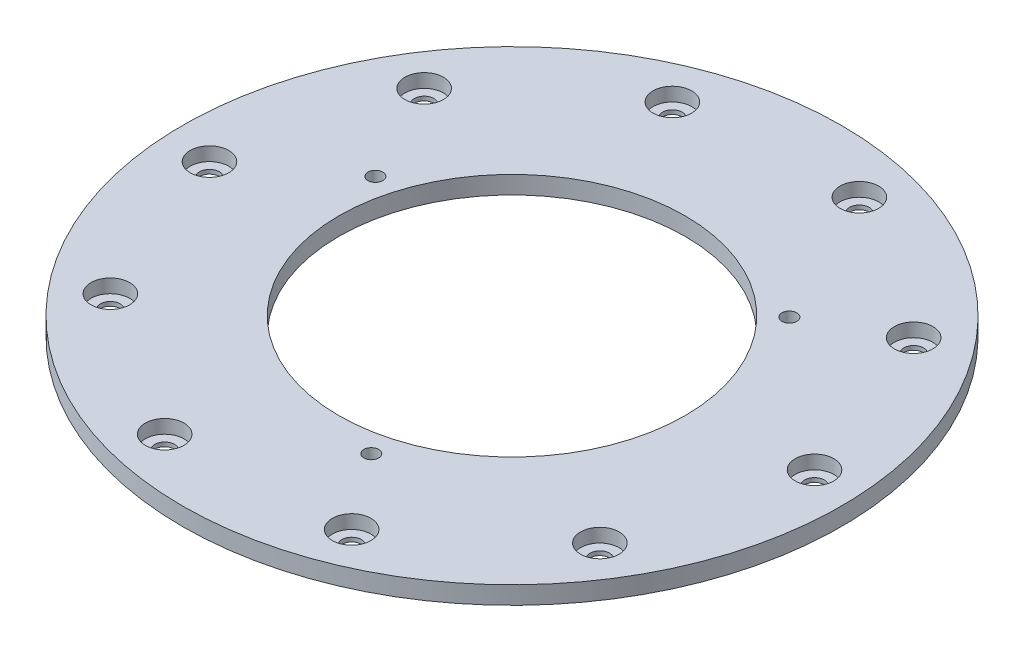
ISO-10303-21;
HEADER;
FILE_DESCRIPTION(('STEP AP214'),'2;1');
FILE_NAME('part.step','',(''),(''),'','','');
FILE_SCHEMA(('AUTOMOTIVE_DESIGN { 1 0 10303 214 1 1 1 1 }'));
ENDSEC;
DATA;
#1=APPLICATION_CONTEXT('core data for automotive mechanical design processes');
#2=APPLICATION_PROTOCOL_DEFINITION('international standard','automotive_design',2000,#1);
#3=PRODUCT_CONTEXT('',#1,'mechanical');
#4=PRODUCT('Part','Part','',(#3));
#5=PRODUCT_RELATED_PRODUCT_CATEGORY('part','',(#4));
#6=PRODUCT_DEFINITION_FORMATION('','',#4);
#7=PRODUCT_DEFINITION_CONTEXT('part definition',#1,'design');
#8=PRODUCT_DEFINITION('design','',#6,#7);
#9=PRODUCT_DEFINITION_SHAPE('','',#8);
#10=(LENGTH_UNIT() NAMED_UNIT(*) SI_UNIT(.MILLI.,.METRE.));
#11=(NAMED_UNIT(*) PLANE_ANGLE_UNIT() SI_UNIT($,.RADIAN.));
#12=(NAMED_UNIT(*) SI_UNIT($,.STERADIAN.) SOLID_ANGLE_UNIT());
#13=UNCERTAINTY_MEASURE_WITH_UNIT(LENGTH_MEASURE(1.E-05),#10,'distance_accuracy_value','');
#14=(GEOMETRIC_REPRESENTATION_CONTEXT(3) GLOBAL_UNCERTAINTY_ASSIGNED_CONTEXT((#13)) GLOBAL_UNIT_ASSIGNED_CONTEXT((#10,
#11,#12)) REPRESENTATION_CONTEXT('',''));
#15=CARTESIAN_POINT('',(0.,0.,0.));
#16=DIRECTION('',(0.,0.,1.));
#17=DIRECTION('',(1.,0.,0.));
#18=AXIS2_PLACEMENT_3D('',#15,#16,#17);
#19=CARTESIAN_POINT('',(0.,6.,0.));
#20=DIRECTION('',(0.,-1.,0.));
#21=DIRECTION('',(0.,0.,-1.));
#22=AXIS2_PLACEMENT_3D('',#19,#20,#21);
#23=CYLINDRICAL_SURFACE('',#22,110.9);
#24=CARTESIAN_POINT('',(0.,6.,0.));
#25=DIRECTION('',(0.,1.,0.));
#26=DIRECTION('',(0.,0.,1.));
#27=AXIS2_PLACEMENT_3D('',#24,#25,#26);
#28=CIRCLE('',#27,110.9);
#29=CARTESIAN_POINT('',(0.,6.,110.9));
#30=VERTEX_POINT('',#29);
#31=EDGE_CURVE('E10',#30,#30,#28,.T.);
#32=ORIENTED_EDGE('',*,*,#31,.F.);
#33=EDGE_LOOP('',(#32));
#34=FACE_BOUND('',#33,.T.);
#35=CARTESIAN_POINT('',(0.,0.,0.));
#36=DIRECTION('',(0.,1.,0.));
#37=DIRECTION('',(0.,0.,1.));
#38=AXIS2_PLACEMENT_3D('',#35,#36,#37);
#39=CIRCLE('',#38,110.9);
#40=CARTESIAN_POINT('',(0.,0.,110.9));
#41=VERTEX_POINT('',#40);
#42=EDGE_CURVE('E37',#41,#41,#39,.T.);
#43=ORIENTED_EDGE('',*,*,#42,.T.);
#44=EDGE_LOOP('',(#43));
#45=FACE_BOUND('',#44,.T.);
#46=ADVANCED_FACE('F34',(#34,#45),#23,.T.);
#47=CARTESIAN_POINT('',(0.,6.,0.));
#48=DIRECTION('',(0.,1.,0.));
#49=DIRECTION('',(0.,0.,1.));
#50=AXIS2_PLACEMENT_3D('',#47,#48,#49);
#51=PLANE('',#50);
#52=CARTESIAN_POINT('',(-63.6022741979834,6.,-17.6281228962286));
#53=DIRECTION('',(0.,1.,0.));
#54=DIRECTION('',(0.,0.,1.));
#55=AXIS2_PLACEMENT_3D('',#52,#53,#54);
#56=CIRCLE('',#55,2.5);
#57=CARTESIAN_POINT('',(-63.6022741979834,6.,-15.1281228962286));
#58=VERTEX_POINT('',#57);
#59=EDGE_CURVE('E186',#58,#58,#56,.T.);
#60=ORIENTED_EDGE('',*,*,#59,.F.);
#61=EDGE_LOOP('',(#60));
#62=FACE_BOUND('',#61,.T.);
#63=CARTESIAN_POINT('',(47.0675393481586,6.,-46.2671237458075));
#64=DIRECTION('',(0.,1.,0.));
#65=DIRECTION('',(0.,0.,1.));
#66=AXIS2_PLACEMENT_3D('',#63,#64,#65);
#67=CIRCLE('',#66,2.5);
#68=CARTESIAN_POINT('',(47.0675393481586,6.,-43.7671237458075));
#69=VERTEX_POINT('',#68);
#70=EDGE_CURVE('E180',#69,#69,#67,.T.);
#71=ORIENTED_EDGE('',*,*,#70,.F.);
#72=EDGE_LOOP('',(#71));
#73=FACE_BOUND('',#72,.T.);
#74=CARTESIAN_POINT('',(16.534734849827,6.,63.8952466420281));
#75=DIRECTION('',(0.,1.,0.));
#76=DIRECTION('',(0.,0.,1.));
#77=AXIS2_PLACEMENT_3D('',#74,#75,#76);
#78=CIRCLE('',#77,2.5);
#79=CARTESIAN_POINT('',(16.534734849827,6.,66.3952466420281));
#80=VERTEX_POINT('',#79);
#81=EDGE_CURVE('E174',#80,#80,#78,.T.);
#82=ORIENTED_EDGE('',*,*,#81,.F.);
#83=EDGE_LOOP('',(#82));
#84=FACE_BOUND('',#83,.T.);
#85=CARTESIAN_POINT('',(-35.3046883212491,6.,-89.2724984669941));
#86=DIRECTION('',(0.,1.,0.));
#87=DIRECTION('',(0.,0.,1.));
#88=AXIS2_PLACEMENT_3D('',#85,#86,#87);
#89=CIRCLE('',#88,6.5);
#90=CARTESIAN_POINT('',(-35.3046883212491,6.,-82.7724984669941));
#91=VERTEX_POINT('',#90);
#92=EDGE_CURVE('E168',#91,#91,#89,.T.);
#93=ORIENTED_EDGE('',*,*,#92,.F.);
#94=EDGE_LOOP('',(#93));
#95=FACE_BOUND('',#94,.T.);
#96=CARTESIAN_POINT('',(23.9109652012001,6.,-92.9745435221247));
#97=DIRECTION('',(0.,1.,0.));
#98=DIRECTION('',(0.,0.,1.));
#99=AXIS2_PLACEMENT_3D('',#96,#97,#98);
#100=CIRCLE('',#99,6.5);
#101=CARTESIAN_POINT('',(23.9109652012001,6.,-86.4745435221247));
#102=VERTEX_POINT('',#101);
#103=EDGE_CURVE('E156',#102,#102,#100,.T.);
#104=ORIENTED_EDGE('',*,*,#103,.F.);
#105=EDGE_LOOP('',(#104));
#106=FACE_BOUND('',#105,.T.);
#107=CARTESIAN_POINT('',(73.9934427206083,6.,-61.1634730403106));
#108=DIRECTION('',(0.,1.,0.));
#109=DIRECTION('',(0.,0.,1.));
#110=AXIS2_PLACEMENT_3D('',#107,#108,#109);
#111=CIRCLE('',#110,6.49999999999999);
#112=CARTESIAN_POINT('',(73.9934427206083,6.,-54.6634730403106));
#113=VERTEX_POINT('',#112);
#114=EDGE_CURVE('E144',#113,#113,#111,.T.);
#115=ORIENTED_EDGE('',*,*,#114,.F.);
#116=EDGE_LOOP('',(#115));
#117=FACE_BOUND('',#116,.T.);
#118=CARTESIAN_POINT('',(95.8129400653641,6.,-5.99003472708635));
#119=DIRECTION('',(0.,1.,0.));
#120=DIRECTION('',(0.,0.,1.));
#121=AXIS2_PLACEMENT_3D('',#118,#119,#120);
#122=CIRCLE('',#121,6.49999999999999);
#123=CARTESIAN_POINT('',(95.8129400653641,6.,0.509965272913644));
#124=VERTEX_POINT('',#123);
#125=EDGE_CURVE('E132',#124,#124,#122,.T.);
#126=ORIENTED_EDGE('',*,*,#125,.F.);
#127=EDGE_LOOP('',(#126));
#128=FACE_BOUND('',#127,.T.);
#129=CARTESIAN_POINT('',(81.0351508672088,6.,51.4713932580921));
#130=DIRECTION('',(0.,1.,0.));
#131=DIRECTION('',(0.,0.,1.));
#132=AXIS2_PLACEMENT_3D('',#129,#130,#131);
#133=CIRCLE('',#132,6.49999999999999);
#134=CARTESIAN_POINT('',(81.0351508672088,6.,57.9713932580921));
#135=VERTEX_POINT('',#134);
#136=EDGE_CURVE('E120',#135,#135,#133,.T.);
#137=ORIENTED_EDGE('',*,*,#136,.F.);
#138=EDGE_LOOP('',(#137));
#139=FACE_BOUND('',#138,.T.);
#140=CARTESIAN_POINT('',(35.3046883212567,6.,89.2724984669911));
#141=DIRECTION('',(0.,1.,0.));
#142=DIRECTION('',(0.,0.,1.));
#143=AXIS2_PLACEMENT_3D('',#140,#141,#142);
#144=CIRCLE('',#143,6.49999999999999);
#145=CARTESIAN_POINT('',(35.3046883212567,6.,95.7724984669911));
#146=VERTEX_POINT('',#145);
#147=EDGE_CURVE('E108',#146,#146,#144,.T.);
#148=ORIENTED_EDGE('',*,*,#147,.F.);
#149=EDGE_LOOP('',(#148));
#150=FACE_BOUND('',#149,.T.);
#151=CARTESIAN_POINT('',(-23.9109652011925,6.,92.9745435221217));
#152=DIRECTION('',(0.,1.,0.));
#153=DIRECTION('',(0.,0.,1.));
#154=AXIS2_PLACEMENT_3D('',#151,#152,#153);
#155=CIRCLE('',#154,6.5);
#156=CARTESIAN_POINT('',(-23.9109652011925,6.,99.4745435221217));
#157=VERTEX_POINT('',#156);
#158=EDGE_CURVE('E96',#157,#157,#155,.T.);
#159=ORIENTED_EDGE('',*,*,#158,.F.);
#160=EDGE_LOOP('',(#159));
#161=FACE_BOUND('',#160,.T.);
#162=CARTESIAN_POINT('',(-73.9934427206007,6.,61.1634730403076));
#163=DIRECTION('',(0.,1.,0.));
#164=DIRECTION('',(0.,0.,1.));
#165=AXIS2_PLACEMENT_3D('',#162,#163,#164);
#166=CIRCLE('',#165,6.49999999999999);
#167=CARTESIAN_POINT('',(-73.9934427206007,6.,67.6634730403076));
#168=VERTEX_POINT('',#167);
#169=EDGE_CURVE('E84',#168,#168,#166,.T.);
#170=ORIENTED_EDGE('',*,*,#169,.F.);
#171=EDGE_LOOP('',(#170));
#172=FACE_BOUND('',#171,.T.);
#173=CARTESIAN_POINT('',(-95.8129400653565,6.,5.99003472708336));
#174=DIRECTION('',(0.,1.,0.));
#175=DIRECTION('',(0.,0.,1.));
#176=AXIS2_PLACEMENT_3D('',#173,#174,#175);
#177=CIRCLE('',#176,6.49999999999999);
#178=CARTESIAN_POINT('',(-95.8129400653565,6.,12.4900347270834));
#179=VERTEX_POINT('',#178);
#180=EDGE_CURVE('E72',#179,#179,#177,.T.);
#181=ORIENTED_EDGE('',*,*,#180,.F.);
#182=EDGE_LOOP('',(#181));
#183=FACE_BOUND('',#182,.T.);
#184=CARTESIAN_POINT('',(-81.0351508672012,6.,-51.4713932580952));
#185=DIRECTION('',(0.,1.,0.));
#186=DIRECTION('',(0.,0.,1.));
#187=AXIS2_PLACEMENT_3D('',#184,#185,#186);
#188=CIRCLE('',#187,6.49999999999999);
#189=CARTESIAN_POINT('',(-81.0351508672012,6.,-44.9713932580952));
#190=VERTEX_POINT('',#189);
#191=EDGE_CURVE('E60',#190,#190,#188,.T.);
#192=ORIENTED_EDGE('',*,*,#191,.F.);
#193=EDGE_LOOP('',(#192));
#194=FACE_BOUND('',#193,.T.);
#195=CARTESIAN_POINT('',(0.,6.,0.));
#196=DIRECTION('',(0.,1.,0.));
#197=DIRECTION('',(0.,0.,1.));
#198=AXIS2_PLACEMENT_3D('',#195,#196,#197);
#199=CIRCLE('',#198,58.25);
#200=CARTESIAN_POINT('',(0.,6.,58.25));
#201=VERTEX_POINT('',#200);
#202=EDGE_CURVE('E46',#201,#201,#199,.T.);
#203=ORIENTED_EDGE('',*,*,#202,.F.);
#204=EDGE_LOOP('',(#203));
#205=FACE_BOUND('',#204,.T.);
#206=ORIENTED_EDGE('',*,*,#31,.T.);
#207=EDGE_LOOP('',(#206));
#208=FACE_BOUND('',#207,.T.);
#209=ADVANCED_FACE('F192',(#62,#73,#84,#95,#106,#117,#128,#139,#150,#161,#172,#183,#194,#205,
#208),#51,.T.);
#210=CARTESIAN_POINT('',(0.,0.,0.));
#211=DIRECTION('',(0.,1.,0.));
#212=DIRECTION('',(0.,0.,1.));
#213=AXIS2_PLACEMENT_3D('',#210,#211,#212);
#214=PLANE('',#213);
#215=CARTESIAN_POINT('',(-63.6022741979834,0.,-17.6281228962286));
#216=DIRECTION('',(0.,1.,0.));
#217=DIRECTION('',(0.,0.,1.));
#218=AXIS2_PLACEMENT_3D('',#215,#216,#217);
#219=CIRCLE('',#218,2.5);
#220=CARTESIAN_POINT('',(-63.6022741979834,0.,-15.1281228962286));
#221=VERTEX_POINT('',#220);
#222=EDGE_CURVE('E183',#221,#221,#219,.T.);
#223=ORIENTED_EDGE('',*,*,#222,.T.);
#224=EDGE_LOOP('',(#223));
#225=FACE_BOUND('',#224,.T.);
#226=CARTESIAN_POINT('',(47.0675393481586,0.,-46.2671237458075));
#227=DIRECTION('',(0.,1.,0.));
#228=DIRECTION('',(0.,0.,1.));
#229=AXIS2_PLACEMENT_3D('',#226,#227,#228);
#230=CIRCLE('',#229,2.5);
#231=CARTESIAN_POINT('',(47.0675393481586,0.,-43.7671237458075));
#232=VERTEX_POINT('',#231);
#233=EDGE_CURVE('E177',#232,#232,#230,.T.);
#234=ORIENTED_EDGE('',*,*,#233,.T.);
#235=EDGE_LOOP('',(#234));
#236=FACE_BOUND('',#235,.T.);
#237=CARTESIAN_POINT('',(16.534734849827,0.,63.8952466420281));
#238=DIRECTION('',(0.,1.,0.));
#239=DIRECTION('',(0.,0.,1.));
#240=AXIS2_PLACEMENT_3D('',#237,#238,#239);
#241=CIRCLE('',#240,2.5);
#242=CARTESIAN_POINT('',(16.534734849827,0.,66.3952466420281));
#243=VERTEX_POINT('',#242);
#244=EDGE_CURVE('E171',#243,#243,#241,.T.);
#245=ORIENTED_EDGE('',*,*,#244,.T.);
#246=EDGE_LOOP('',(#245));
#247=FACE_BOUND('',#246,.T.);
#248=CARTESIAN_POINT('',(-35.3046883212491,0.,-89.2724984669941));
#249=DIRECTION('',(0.,1.,0.));
#250=DIRECTION('',(0.,0.,1.));
#251=AXIS2_PLACEMENT_3D('',#248,#249,#250);
#252=CIRCLE('',#251,3.3);
#253=CARTESIAN_POINT('',(-35.3046883212491,0.,-85.9724984669941));
#254=VERTEX_POINT('',#253);
#255=EDGE_CURVE('E159',#254,#254,#252,.T.);
#256=ORIENTED_EDGE('',*,*,#255,.T.);
#257=EDGE_LOOP('',(#256));
#258=FACE_BOUND('',#257,.T.);
#259=CARTESIAN_POINT('',(23.9109652012001,0.,-92.9745435221247));
#260=DIRECTION('',(0.,1.,0.));
#261=DIRECTION('',(0.,0.,1.));
#262=AXIS2_PLACEMENT_3D('',#259,#260,#261);
#263=CIRCLE('',#262,3.3);
#264=CARTESIAN_POINT('',(23.9109652012001,0.,-89.6745435221247));
#265=VERTEX_POINT('',#264);
#266=EDGE_CURVE('E147',#265,#265,#263,.T.);
#267=ORIENTED_EDGE('',*,*,#266,.T.);
#268=EDGE_LOOP('',(#267));
#269=FACE_BOUND('',#268,.T.);
#270=CARTESIAN_POINT('',(73.9934427206083,0.,-61.1634730403106));
#271=DIRECTION('',(0.,1.,0.));
#272=DIRECTION('',(0.,0.,1.));
#273=AXIS2_PLACEMENT_3D('',#270,#271,#272);
#274=CIRCLE('',#273,3.30000000000001);
#275=CARTESIAN_POINT('',(73.9934427206083,0.,-57.8634730403106));
#276=VERTEX_POINT('',#275);
#277=EDGE_CURVE('E135',#276,#276,#274,.T.);
#278=ORIENTED_EDGE('',*,*,#277,.T.);
#279=EDGE_LOOP('',(#278));
#280=FACE_BOUND('',#279,.T.);
#281=CARTESIAN_POINT('',(95.8129400653641,0.,-5.99003472708635));
#282=DIRECTION('',(0.,1.,0.));
#283=DIRECTION('',(0.,0.,1.));
#284=AXIS2_PLACEMENT_3D('',#281,#282,#283);
#285=CIRCLE('',#284,3.30000000000001);
#286=CARTESIAN_POINT('',(95.8129400653641,0.,-2.69003472708634));
#287=VERTEX_POINT('',#286);
#288=EDGE_CURVE('E123',#287,#287,#285,.T.);
#289=ORIENTED_EDGE('',*,*,#288,.T.);
#290=EDGE_LOOP('',(#289));
#291=FACE_BOUND('',#290,.T.);
#292=CARTESIAN_POINT('',(81.0351508672088,0.,51.4713932580921));
#293=DIRECTION('',(0.,1.,0.));
#294=DIRECTION('',(0.,0.,1.));
#295=AXIS2_PLACEMENT_3D('',#292,#293,#294);
#296=CIRCLE('',#295,3.30000000000001);
#297=CARTESIAN_POINT('',(81.0351508672088,0.,54.7713932580922));
#298=VERTEX_POINT('',#297);
#299=EDGE_CURVE('E111',#298,#298,#296,.T.);
#300=ORIENTED_EDGE('',*,*,#299,.T.);
#301=EDGE_LOOP('',(#300));
#302=FACE_BOUND('',#301,.T.);
#303=CARTESIAN_POINT('',(35.3046883212567,0.,89.2724984669911));
#304=DIRECTION('',(0.,1.,0.));
#305=DIRECTION('',(0.,0.,1.));
#306=AXIS2_PLACEMENT_3D('',#303,#304,#305);
#307=CIRCLE('',#306,3.3);
#308=CARTESIAN_POINT('',(35.3046883212567,0.,92.5724984669911));
#309=VERTEX_POINT('',#308);
#310=EDGE_CURVE('E99',#309,#309,#307,.T.);
#311=ORIENTED_EDGE('',*,*,#310,.T.);
#312=EDGE_LOOP('',(#311));
#313=FACE_BOUND('',#312,.T.);
#314=CARTESIAN_POINT('',(-23.9109652011925,0.,92.9745435221217));
#315=DIRECTION('',(0.,1.,0.));
#316=DIRECTION('',(0.,0.,1.));
#317=AXIS2_PLACEMENT_3D('',#314,#315,#316);
#318=CIRCLE('',#317,3.3);
#319=CARTESIAN_POINT('',(-23.9109652011925,0.,96.2745435221217));
#320=VERTEX_POINT('',#319);
#321=EDGE_CURVE('E87',#320,#320,#318,.T.);
#322=ORIENTED_EDGE('',*,*,#321,.T.);
#323=EDGE_LOOP('',(#322));
#324=FACE_BOUND('',#323,.T.);
#325=CARTESIAN_POINT('',(-73.9934427206007,0.,61.1634730403076));
#326=DIRECTION('',(0.,1.,0.));
#327=DIRECTION('',(0.,0.,1.));
#328=AXIS2_PLACEMENT_3D('',#325,#326,#327);
#329=CIRCLE('',#328,3.30000000000001);
#330=CARTESIAN_POINT('',(-73.9934427206007,0.,64.4634730403076));
#331=VERTEX_POINT('',#330);
#332=EDGE_CURVE('E75',#331,#331,#329,.T.);
#333=ORIENTED_EDGE('',*,*,#332,.T.);
#334=EDGE_LOOP('',(#333));
#335=FACE_BOUND('',#334,.T.);
#336=CARTESIAN_POINT('',(-95.8129400653565,0.,5.99003472708336));
#337=DIRECTION('',(0.,1.,0.));
#338=DIRECTION('',(0.,0.,1.));
#339=AXIS2_PLACEMENT_3D('',#336,#337,#338);
#340=CIRCLE('',#339,3.30000000000001);
#341=CARTESIAN_POINT('',(-95.8129400653565,0.,9.29003472708337));
#342=VERTEX_POINT('',#341);
#343=EDGE_CURVE('E63',#342,#342,#340,.T.);
#344=ORIENTED_EDGE('',*,*,#343,.T.);
#345=EDGE_LOOP('',(#344));
#346=FACE_BOUND('',#345,.T.);
#347=CARTESIAN_POINT('',(-81.0351508672012,0.,-51.4713932580952));
#348=DIRECTION('',(0.,1.,0.));
#349=DIRECTION('',(0.,0.,1.));
#350=AXIS2_PLACEMENT_3D('',#347,#348,#349);
#351=CIRCLE('',#350,3.30000000000001);
#352=CARTESIAN_POINT('',(-81.0351508672012,0.,-48.1713932580952));
#353=VERTEX_POINT('',#352);
#354=EDGE_CURVE('E49',#353,#353,#351,.T.);
#355=ORIENTED_EDGE('',*,*,#354,.T.);
#356=EDGE_LOOP('',(#355));
#357=FACE_BOUND('',#356,.T.);
#358=CARTESIAN_POINT('',(0.,0.,0.));
#359=DIRECTION('',(0.,1.,0.));
#360=DIRECTION('',(0.,0.,1.));
#361=AXIS2_PLACEMENT_3D('',#358,#359,#360);
#362=CIRCLE('',#361,58.25);
#363=CARTESIAN_POINT('',(0.,0.,58.25));
#364=VERTEX_POINT('',#363);
#365=EDGE_CURVE('E44',#364,#364,#362,.T.);
#366=ORIENTED_EDGE('',*,*,#365,.T.);
#367=EDGE_LOOP('',(#366));
#368=FACE_BOUND('',#367,.T.);
#369=ORIENTED_EDGE('',*,*,#42,.F.);
#370=EDGE_LOOP('',(#369));
#371=FACE_BOUND('',#370,.T.);
#372=ADVANCED_FACE('F195',(#225,#236,#247,#258,#269,#280,#291,#302,#313,#324,#335,#346,#357,
#368,#371),#214,.F.);
#373=CARTESIAN_POINT('',(0.,0.,0.));
#374=DIRECTION('',(0.,1.,0.));
#375=DIRECTION('',(0.,0.,1.));
#376=AXIS2_PLACEMENT_3D('',#373,#374,#375);
#377=CYLINDRICAL_SURFACE('',#376,58.25);
#378=ORIENTED_EDGE('',*,*,#365,.F.);
#379=EDGE_LOOP('',(#378));
#380=FACE_BOUND('',#379,.T.);
#381=ORIENTED_EDGE('',*,*,#202,.T.);
#382=EDGE_LOOP('',(#381));
#383=FACE_BOUND('',#382,.T.);
#384=ADVANCED_FACE('F223',(#380,#383),#377,.F.);
#385=CARTESIAN_POINT('',(-81.0351508672012,6.,-51.4713932580952));
#386=DIRECTION('',(0.,1.,0.));
#387=DIRECTION('',(0.,0.,1.));
#388=AXIS2_PLACEMENT_3D('',#385,#386,#387);
#389=CYLINDRICAL_SURFACE('',#388,3.30000000000001);
#390=ORIENTED_EDGE('',*,*,#354,.F.);
#391=EDGE_LOOP('',(#390));
#392=FACE_BOUND('',#391,.T.);
#393=CARTESIAN_POINT('',(-81.0351508672012,1.4,-51.4713932580952));
#394=DIRECTION('',(0.,1.,0.));
#395=DIRECTION('',(0.,0.,1.));
#396=AXIS2_PLACEMENT_3D('',#393,#394,#395);
#397=CIRCLE('',#396,3.30000000000001);
#398=CARTESIAN_POINT('',(-81.0351508672012,1.4,-48.1713932580952));
#399=VERTEX_POINT('',#398);
#400=EDGE_CURVE('E54',#399,#399,#397,.T.);
#401=ORIENTED_EDGE('',*,*,#400,.T.);
#402=EDGE_LOOP('',(#401));
#403=FACE_BOUND('',#402,.T.);
#404=ADVANCED_FACE('F225',(#392,#403),#389,.F.);
#405=CARTESIAN_POINT('',(-77.7351508672012,1.4,-51.4713932580952));
#406=DIRECTION('',(0.,-1.,0.));
#407=DIRECTION('',(0.,0.,-1.));
#408=AXIS2_PLACEMENT_3D('',#405,#406,#407);
#409=PLANE('',#408);
#410=ORIENTED_EDGE('',*,*,#400,.F.);
#411=EDGE_LOOP('',(#410));
#412=FACE_BOUND('',#411,.T.);
#413=CARTESIAN_POINT('',(-81.0351508672012,1.4,-51.4713932580952));
#414=DIRECTION('',(0.,1.,0.));
#415=DIRECTION('',(0.,0.,1.));
#416=AXIS2_PLACEMENT_3D('',#413,#414,#415);
#417=CIRCLE('',#416,6.50000000000001);
#418=CARTESIAN_POINT('',(-81.0351508672012,1.4,-44.9713932580952));
#419=VERTEX_POINT('',#418);
#420=EDGE_CURVE('E57',#419,#419,#417,.T.);
#421=ORIENTED_EDGE('',*,*,#420,.T.);
#422=EDGE_LOOP('',(#421));
#423=FACE_BOUND('',#422,.T.);
#424=ADVANCED_FACE('F232',(#412,#423),#409,.F.);
#425=CARTESIAN_POINT('',(-81.0351508672012,6.,-51.4713932580952));
#426=DIRECTION('',(0.,1.,0.));
#427=DIRECTION('',(0.,0.,1.));
#428=AXIS2_PLACEMENT_3D('',#425,#426,#427);
#429=CYLINDRICAL_SURFACE('',#428,6.5);
#430=ORIENTED_EDGE('',*,*,#420,.F.);
#431=EDGE_LOOP('',(#430));
#432=FACE_BOUND('',#431,.T.);
#433=ORIENTED_EDGE('',*,*,#191,.T.);
#434=EDGE_LOOP('',(#433));
#435=FACE_BOUND('',#434,.T.);
#436=ADVANCED_FACE('F397',(#432,#435),#429,.F.);
#437=CARTESIAN_POINT('',(-95.8129400653565,6.,5.99003472708336));
#438=DIRECTION('',(0.,1.,0.));
#439=DIRECTION('',(0.,0.,1.));
#440=AXIS2_PLACEMENT_3D('',#437,#438,#439);
#441=CYLINDRICAL_SURFACE('',#440,3.30000000000001);
#442=ORIENTED_EDGE('',*,*,#343,.F.);
#443=EDGE_LOOP('',(#442));
#444=FACE_BOUND('',#443,.T.);
#445=CARTESIAN_POINT('',(-95.8129400653565,1.4,5.99003472708336));
#446=DIRECTION('',(0.,1.,0.));
#447=DIRECTION('',(0.,0.,1.));
#448=AXIS2_PLACEMENT_3D('',#445,#446,#447);
#449=CIRCLE('',#448,3.30000000000001);
#450=CARTESIAN_POINT('',(-95.8129400653565,1.4,9.29003472708337));
#451=VERTEX_POINT('',#450);
#452=EDGE_CURVE('E66',#451,#451,#449,.T.);
#453=ORIENTED_EDGE('',*,*,#452,.T.);
#454=EDGE_LOOP('',(#453));
#455=FACE_BOUND('',#454,.T.);
#456=ADVANCED_FACE('F393',(#444,#455),#441,.F.);
#457=CARTESIAN_POINT('',(-92.5129400653564,1.4,5.99003472708336));
#458=DIRECTION('',(0.,-1.,0.));
#459=DIRECTION('',(0.,0.,-1.));
#460=AXIS2_PLACEMENT_3D('',#457,#458,#459);
#461=PLANE('',#460);
#462=ORIENTED_EDGE('',*,*,#452,.F.);
#463=EDGE_LOOP('',(#462));
#464=FACE_BOUND('',#463,.T.);
#465=CARTESIAN_POINT('',(-95.8129400653565,1.4,5.99003472708336));
#466=DIRECTION('',(0.,1.,0.));
#467=DIRECTION('',(0.,0.,1.));
#468=AXIS2_PLACEMENT_3D('',#465,#466,#467);
#469=CIRCLE('',#468,6.50000000000001);
#470=CARTESIAN_POINT('',(-95.8129400653565,1.4,12.4900347270834));
#471=VERTEX_POINT('',#470);
#472=EDGE_CURVE('E69',#471,#471,#469,.T.);
#473=ORIENTED_EDGE('',*,*,#472,.T.);
#474=EDGE_LOOP('',(#473));
#475=FACE_BOUND('',#474,.T.);
#476=ADVANCED_FACE('F389',(#464,#475),#461,.F.);
#477=CARTESIAN_POINT('',(-95.8129400653565,6.,5.99003472708336));
#478=DIRECTION('',(0.,1.,0.));
#479=DIRECTION('',(0.,0.,1.));
#480=AXIS2_PLACEMENT_3D('',#477,#478,#479);
#481=CYLINDRICAL_SURFACE('',#480,6.5);
#482=ORIENTED_EDGE('',*,*,#472,.F.);
#483=EDGE_LOOP('',(#482));
#484=FACE_BOUND('',#483,.T.);
#485=ORIENTED_EDGE('',*,*,#180,.T.);
#486=EDGE_LOOP('',(#485));
#487=FACE_BOUND('',#486,.T.);
#488=ADVANCED_FACE('F385',(#484,#487),#481,.F.);
#489=CARTESIAN_POINT('',(-73.9934427206007,6.,61.1634730403076));
#490=DIRECTION('',(0.,1.,0.));
#491=DIRECTION('',(0.,0.,1.));
#492=AXIS2_PLACEMENT_3D('',#489,#490,#491);
#493=CYLINDRICAL_SURFACE('',#492,3.30000000000001);
#494=ORIENTED_EDGE('',*,*,#332,.F.);
#495=EDGE_LOOP('',(#494));
#496=FACE_BOUND('',#495,.T.);
#497=CARTESIAN_POINT('',(-73.9934427206007,1.4,61.1634730403076));
#498=DIRECTION('',(0.,1.,0.));
#499=DIRECTION('',(0.,0.,1.));
#500=AXIS2_PLACEMENT_3D('',#497,#498,#499);
#501=CIRCLE('',#500,3.30000000000001);
#502=CARTESIAN_POINT('',(-73.9934427206007,1.4,64.4634730403076));
#503=VERTEX_POINT('',#502);
#504=EDGE_CURVE('E78',#503,#503,#501,.T.);
#505=ORIENTED_EDGE('',*,*,#504,.T.);
#506=EDGE_LOOP('',(#505));
#507=FACE_BOUND('',#506,.T.);
#508=ADVANCED_FACE('F381',(#496,#507),#493,.F.);
#509=CARTESIAN_POINT('',(-70.6934427206007,1.4,61.1634730403076));
#510=DIRECTION('',(0.,-1.,0.));
#511=DIRECTION('',(0.,0.,-1.));
#512=AXIS2_PLACEMENT_3D('',#509,#510,#511);
#513=PLANE('',#512);
#514=ORIENTED_EDGE('',*,*,#504,.F.);
#515=EDGE_LOOP('',(#514));
#516=FACE_BOUND('',#515,.T.);
#517=CARTESIAN_POINT('',(-73.9934427206007,1.4,61.1634730403076));
#518=DIRECTION('',(0.,1.,0.));
#519=DIRECTION('',(0.,0.,1.));
#520=AXIS2_PLACEMENT_3D('',#517,#518,#519);
#521=CIRCLE('',#520,6.50000000000001);
#522=CARTESIAN_POINT('',(-73.9934427206007,1.4,67.6634730403077));
#523=VERTEX_POINT('',#522);
#524=EDGE_CURVE('E81',#523,#523,#521,.T.);
#525=ORIENTED_EDGE('',*,*,#524,.T.);
#526=EDGE_LOOP('',(#525));
#527=FACE_BOUND('',#526,.T.);
#528=ADVANCED_FACE('F377',(#516,#527),#513,.F.);
#529=CARTESIAN_POINT('',(-73.9934427206007,6.,61.1634730403076));
#530=DIRECTION('',(0.,1.,0.));
#531=DIRECTION('',(0.,0.,1.));
#532=AXIS2_PLACEMENT_3D('',#529,#530,#531);
#533=CYLINDRICAL_SURFACE('',#532,6.5);
#534=ORIENTED_EDGE('',*,*,#524,.F.);
#535=EDGE_LOOP('',(#534));
#536=FACE_BOUND('',#535,.T.);
#537=ORIENTED_EDGE('',*,*,#169,.T.);
#538=EDGE_LOOP('',(#537));
#539=FACE_BOUND('',#538,.T.);
#540=ADVANCED_FACE('F373',(#536,#539),#533,.F.);
#541=CARTESIAN_POINT('',(-23.9109652011925,6.,92.9745435221217));
#542=DIRECTION('',(0.,1.,0.));
#543=DIRECTION('',(0.,0.,1.));
#544=AXIS2_PLACEMENT_3D('',#541,#542,#543);
#545=CYLINDRICAL_SURFACE('',#544,3.30000000000001);
#546=ORIENTED_EDGE('',*,*,#321,.F.);
#547=EDGE_LOOP('',(#546));
#548=FACE_BOUND('',#547,.T.);
#549=CARTESIAN_POINT('',(-23.9109652011925,1.4,92.9745435221217));
#550=DIRECTION('',(0.,1.,0.));
#551=DIRECTION('',(0.,0.,1.));
#552=AXIS2_PLACEMENT_3D('',#549,#550,#551);
#553=CIRCLE('',#552,3.30000000000001);
#554=CARTESIAN_POINT('',(-23.9109652011925,1.4,96.2745435221217));
#555=VERTEX_POINT('',#554);
#556=EDGE_CURVE('E90',#555,#555,#553,.T.);
#557=ORIENTED_EDGE('',*,*,#556,.T.);
#558=EDGE_LOOP('',(#557));
#559=FACE_BOUND('',#558,.T.);
#560=ADVANCED_FACE('F369',(#548,#559),#545,.F.);
#561=CARTESIAN_POINT('',(-20.6109652011925,1.4,92.9745435221217));
#562=DIRECTION('',(0.,-1.,0.));
#563=DIRECTION('',(0.,0.,-1.));
#564=AXIS2_PLACEMENT_3D('',#561,#562,#563);
#565=PLANE('',#564);
#566=ORIENTED_EDGE('',*,*,#556,.F.);
#567=EDGE_LOOP('',(#566));
#568=FACE_BOUND('',#567,.T.);
#569=CARTESIAN_POINT('',(-23.9109652011925,1.4,92.9745435221217));
#570=DIRECTION('',(0.,1.,0.));
#571=DIRECTION('',(0.,0.,1.));
#572=AXIS2_PLACEMENT_3D('',#569,#570,#571);
#573=CIRCLE('',#572,6.5);
#574=CARTESIAN_POINT('',(-23.9109652011925,1.4,99.4745435221217));
#575=VERTEX_POINT('',#574);
#576=EDGE_CURVE('E93',#575,#575,#573,.T.);
#577=ORIENTED_EDGE('',*,*,#576,.T.);
#578=EDGE_LOOP('',(#577));
#579=FACE_BOUND('',#578,.T.);
#580=ADVANCED_FACE('F365',(#568,#579),#565,.F.);
#581=CARTESIAN_POINT('',(-23.9109652011925,6.,92.9745435221217));
#582=DIRECTION('',(0.,1.,0.));
#583=DIRECTION('',(0.,0.,1.));
#584=AXIS2_PLACEMENT_3D('',#581,#582,#583);
#585=CYLINDRICAL_SURFACE('',#584,6.5);
#586=ORIENTED_EDGE('',*,*,#576,.F.);
#587=EDGE_LOOP('',(#586));
#588=FACE_BOUND('',#587,.T.);
#589=ORIENTED_EDGE('',*,*,#158,.T.);
#590=EDGE_LOOP('',(#589));
#591=FACE_BOUND('',#590,.T.);
#592=ADVANCED_FACE('F361',(#588,#591),#585,.F.);
#593=CARTESIAN_POINT('',(35.3046883212567,6.,89.2724984669911));
#594=DIRECTION('',(0.,1.,0.));
#595=DIRECTION('',(0.,0.,1.));
#596=AXIS2_PLACEMENT_3D('',#593,#594,#595);
#597=CYLINDRICAL_SURFACE('',#596,3.30000000000001);
#598=ORIENTED_EDGE('',*,*,#310,.F.);
#599=EDGE_LOOP('',(#598));
#600=FACE_BOUND('',#599,.T.);
#601=CARTESIAN_POINT('',(35.3046883212567,1.4,89.2724984669911));
#602=DIRECTION('',(0.,1.,0.));
#603=DIRECTION('',(0.,0.,1.));
#604=AXIS2_PLACEMENT_3D('',#601,#602,#603);
#605=CIRCLE('',#604,3.30000000000001);
#606=CARTESIAN_POINT('',(35.3046883212567,1.4,92.5724984669911));
#607=VERTEX_POINT('',#606);
#608=EDGE_CURVE('E102',#607,#607,#605,.T.);
#609=ORIENTED_EDGE('',*,*,#608,.T.);
#610=EDGE_LOOP('',(#609));
#611=FACE_BOUND('',#610,.T.);
#612=ADVANCED_FACE('F357',(#600,#611),#597,.F.);
#613=CARTESIAN_POINT('',(38.6046883212567,1.4,89.2724984669911));
#614=DIRECTION('',(0.,-1.,0.));
#615=DIRECTION('',(0.,0.,-1.));
#616=AXIS2_PLACEMENT_3D('',#613,#614,#615);
#617=PLANE('',#616);
#618=ORIENTED_EDGE('',*,*,#608,.F.);
#619=EDGE_LOOP('',(#618));
#620=FACE_BOUND('',#619,.T.);
#621=CARTESIAN_POINT('',(35.3046883212567,1.4,89.2724984669911));
#622=DIRECTION('',(0.,1.,0.));
#623=DIRECTION('',(0.,0.,1.));
#624=AXIS2_PLACEMENT_3D('',#621,#622,#623);
#625=CIRCLE('',#624,6.5);
#626=CARTESIAN_POINT('',(35.3046883212567,1.4,95.7724984669911));
#627=VERTEX_POINT('',#626);
#628=EDGE_CURVE('E105',#627,#627,#625,.T.);
#629=ORIENTED_EDGE('',*,*,#628,.T.);
#630=EDGE_LOOP('',(#629));
#631=FACE_BOUND('',#630,.T.);
#632=ADVANCED_FACE('F353',(#620,#631),#617,.F.);
#633=CARTESIAN_POINT('',(35.3046883212567,6.,89.2724984669911));
#634=DIRECTION('',(0.,1.,0.));
#635=DIRECTION('',(0.,0.,1.));
#636=AXIS2_PLACEMENT_3D('',#633,#634,#635);
#637=CYLINDRICAL_SURFACE('',#636,6.5);
#638=ORIENTED_EDGE('',*,*,#628,.F.);
#639=EDGE_LOOP('',(#638));
#640=FACE_BOUND('',#639,.T.);
#641=ORIENTED_EDGE('',*,*,#147,.T.);
#642=EDGE_LOOP('',(#641));
#643=FACE_BOUND('',#642,.T.);
#644=ADVANCED_FACE('F349',(#640,#643),#637,.F.);
#645=CARTESIAN_POINT('',(81.0351508672088,6.,51.4713932580921));
#646=DIRECTION('',(0.,1.,0.));
#647=DIRECTION('',(0.,0.,1.));
#648=AXIS2_PLACEMENT_3D('',#645,#646,#647);
#649=CYLINDRICAL_SURFACE('',#648,3.30000000000001);
#650=ORIENTED_EDGE('',*,*,#299,.F.);
#651=EDGE_LOOP('',(#650));
#652=FACE_BOUND('',#651,.T.);
#653=CARTESIAN_POINT('',(81.0351508672088,1.4,51.4713932580921));
#654=DIRECTION('',(0.,1.,0.));
#655=DIRECTION('',(0.,0.,1.));
#656=AXIS2_PLACEMENT_3D('',#653,#654,#655);
#657=CIRCLE('',#656,3.30000000000001);
#658=CARTESIAN_POINT('',(81.0351508672088,1.4,54.7713932580922));
#659=VERTEX_POINT('',#658);
#660=EDGE_CURVE('E114',#659,#659,#657,.T.);
#661=ORIENTED_EDGE('',*,*,#660,.T.);
#662=EDGE_LOOP('',(#661));
#663=FACE_BOUND('',#662,.T.);
#664=ADVANCED_FACE('F345',(#652,#663),#649,.F.);
#665=CARTESIAN_POINT('',(84.3351508672088,1.4,51.4713932580921));
#666=DIRECTION('',(0.,-1.,0.));
#667=DIRECTION('',(0.,0.,-1.));
#668=AXIS2_PLACEMENT_3D('',#665,#666,#667);
#669=PLANE('',#668);
#670=ORIENTED_EDGE('',*,*,#660,.F.);
#671=EDGE_LOOP('',(#670));
#672=FACE_BOUND('',#671,.T.);
#673=CARTESIAN_POINT('',(81.0351508672088,1.4,51.4713932580921));
#674=DIRECTION('',(0.,1.,0.));
#675=DIRECTION('',(0.,0.,1.));
#676=AXIS2_PLACEMENT_3D('',#673,#674,#675);
#677=CIRCLE('',#676,6.49999999999999);
#678=CARTESIAN_POINT('',(81.0351508672088,1.4,57.9713932580921));
#679=VERTEX_POINT('',#678);
#680=EDGE_CURVE('E117',#679,#679,#677,.T.);
#681=ORIENTED_EDGE('',*,*,#680,.T.);
#682=EDGE_LOOP('',(#681));
#683=FACE_BOUND('',#682,.T.);
#684=ADVANCED_FACE('F341',(#672,#683),#669,.F.);
#685=CARTESIAN_POINT('',(81.0351508672088,6.,51.4713932580921));
#686=DIRECTION('',(0.,1.,0.));
#687=DIRECTION('',(0.,0.,1.));
#688=AXIS2_PLACEMENT_3D('',#685,#686,#687);
#689=CYLINDRICAL_SURFACE('',#688,6.49999999999999);
#690=ORIENTED_EDGE('',*,*,#680,.F.);
#691=EDGE_LOOP('',(#690));
#692=FACE_BOUND('',#691,.T.);
#693=ORIENTED_EDGE('',*,*,#136,.T.);
#694=EDGE_LOOP('',(#693));
#695=FACE_BOUND('',#694,.T.);
#696=ADVANCED_FACE('F337',(#692,#695),#689,.F.);
#697=CARTESIAN_POINT('',(95.8129400653641,6.,-5.99003472708635));
#698=DIRECTION('',(0.,1.,0.));
#699=DIRECTION('',(0.,0.,1.));
#700=AXIS2_PLACEMENT_3D('',#697,#698,#699);
#701=CYLINDRICAL_SURFACE('',#700,3.30000000000001);
#702=ORIENTED_EDGE('',*,*,#288,.F.);
#703=EDGE_LOOP('',(#702));
#704=FACE_BOUND('',#703,.T.);
#705=CARTESIAN_POINT('',(95.8129400653641,1.4,-5.99003472708635));
#706=DIRECTION('',(0.,1.,0.));
#707=DIRECTION('',(0.,0.,1.));
#708=AXIS2_PLACEMENT_3D('',#705,#706,#707);
#709=CIRCLE('',#708,3.30000000000001);
#710=CARTESIAN_POINT('',(95.8129400653641,1.4,-2.69003472708634));
#711=VERTEX_POINT('',#710);
#712=EDGE_CURVE('E126',#711,#711,#709,.T.);
#713=ORIENTED_EDGE('',*,*,#712,.T.);
#714=EDGE_LOOP('',(#713));
#715=FACE_BOUND('',#714,.T.);
#716=ADVANCED_FACE('F333',(#704,#715),#701,.F.);
#717=CARTESIAN_POINT('',(99.1129400653641,1.4,-5.99003472708635));
#718=DIRECTION('',(0.,-1.,0.));
#719=DIRECTION('',(0.,0.,-1.));
#720=AXIS2_PLACEMENT_3D('',#717,#718,#719);
#721=PLANE('',#720);
#722=ORIENTED_EDGE('',*,*,#712,.F.);
#723=EDGE_LOOP('',(#722));
#724=FACE_BOUND('',#723,.T.);
#725=CARTESIAN_POINT('',(95.8129400653641,1.4,-5.99003472708635));
#726=DIRECTION('',(0.,1.,0.));
#727=DIRECTION('',(0.,0.,1.));
#728=AXIS2_PLACEMENT_3D('',#725,#726,#727);
#729=CIRCLE('',#728,6.50000000000001);
#730=CARTESIAN_POINT('',(95.8129400653641,1.4,0.509965272913658));
#731=VERTEX_POINT('',#730);
#732=EDGE_CURVE('E129',#731,#731,#729,.T.);
#733=ORIENTED_EDGE('',*,*,#732,.T.);
#734=EDGE_LOOP('',(#733));
#735=FACE_BOUND('',#734,.T.);
#736=ADVANCED_FACE('F329',(#724,#735),#721,.F.);
#737=CARTESIAN_POINT('',(95.8129400653641,6.,-5.99003472708635));
#738=DIRECTION('',(0.,1.,0.));
#739=DIRECTION('',(0.,0.,1.));
#740=AXIS2_PLACEMENT_3D('',#737,#738,#739);
#741=CYLINDRICAL_SURFACE('',#740,6.5);
#742=ORIENTED_EDGE('',*,*,#732,.F.);
#743=EDGE_LOOP('',(#742));
#744=FACE_BOUND('',#743,.T.);
#745=ORIENTED_EDGE('',*,*,#125,.T.);
#746=EDGE_LOOP('',(#745));
#747=FACE_BOUND('',#746,.T.);
#748=ADVANCED_FACE('F325',(#744,#747),#741,.F.);
#749=CARTESIAN_POINT('',(73.9934427206083,6.,-61.1634730403106));
#750=DIRECTION('',(0.,1.,0.));
#751=DIRECTION('',(0.,0.,1.));
#752=AXIS2_PLACEMENT_3D('',#749,#750,#751);
#753=CYLINDRICAL_SURFACE('',#752,3.30000000000001);
#754=ORIENTED_EDGE('',*,*,#277,.F.);
#755=EDGE_LOOP('',(#754));
#756=FACE_BOUND('',#755,.T.);
#757=CARTESIAN_POINT('',(73.9934427206083,1.4,-61.1634730403106));
#758=DIRECTION('',(0.,1.,0.));
#759=DIRECTION('',(0.,0.,1.));
#760=AXIS2_PLACEMENT_3D('',#757,#758,#759);
#761=CIRCLE('',#760,3.30000000000001);
#762=CARTESIAN_POINT('',(73.9934427206083,1.4,-57.8634730403106));
#763=VERTEX_POINT('',#762);
#764=EDGE_CURVE('E138',#763,#763,#761,.T.);
#765=ORIENTED_EDGE('',*,*,#764,.T.);
#766=EDGE_LOOP('',(#765));
#767=FACE_BOUND('',#766,.T.);
#768=ADVANCED_FACE('F321',(#756,#767),#753,.F.);
#769=CARTESIAN_POINT('',(77.2934427206083,1.4,-61.1634730403106));
#770=DIRECTION('',(0.,-1.,0.));
#771=DIRECTION('',(0.,0.,-1.));
#772=AXIS2_PLACEMENT_3D('',#769,#770,#771);
#773=PLANE('',#772);
#774=ORIENTED_EDGE('',*,*,#764,.F.);
#775=EDGE_LOOP('',(#774));
#776=FACE_BOUND('',#775,.T.);
#777=CARTESIAN_POINT('',(73.9934427206083,1.4,-61.1634730403106));
#778=DIRECTION('',(0.,1.,0.));
#779=DIRECTION('',(0.,0.,1.));
#780=AXIS2_PLACEMENT_3D('',#777,#778,#779);
#781=CIRCLE('',#780,6.50000000000001);
#782=CARTESIAN_POINT('',(73.9934427206083,1.4,-54.6634730403106));
#783=VERTEX_POINT('',#782);
#784=EDGE_CURVE('E141',#783,#783,#781,.T.);
#785=ORIENTED_EDGE('',*,*,#784,.T.);
#786=EDGE_LOOP('',(#785));
#787=FACE_BOUND('',#786,.T.);
#788=ADVANCED_FACE('F317',(#776,#787),#773,.F.);
#789=CARTESIAN_POINT('',(73.9934427206083,6.,-61.1634730403106));
#790=DIRECTION('',(0.,1.,0.));
#791=DIRECTION('',(0.,0.,1.));
#792=AXIS2_PLACEMENT_3D('',#789,#790,#791);
#793=CYLINDRICAL_SURFACE('',#792,6.5);
#794=ORIENTED_EDGE('',*,*,#784,.F.);
#795=EDGE_LOOP('',(#794));
#796=FACE_BOUND('',#795,.T.);
#797=ORIENTED_EDGE('',*,*,#114,.T.);
#798=EDGE_LOOP('',(#797));
#799=FACE_BOUND('',#798,.T.);
#800=ADVANCED_FACE('F313',(#796,#799),#793,.F.);
#801=CARTESIAN_POINT('',(23.9109652012001,6.,-92.9745435221247));
#802=DIRECTION('',(0.,1.,0.));
#803=DIRECTION('',(0.,0.,1.));
#804=AXIS2_PLACEMENT_3D('',#801,#802,#803);
#805=CYLINDRICAL_SURFACE('',#804,3.30000000000001);
#806=ORIENTED_EDGE('',*,*,#266,.F.);
#807=EDGE_LOOP('',(#806));
#808=FACE_BOUND('',#807,.T.);
#809=CARTESIAN_POINT('',(23.9109652012001,1.4,-92.9745435221247));
#810=DIRECTION('',(0.,1.,0.));
#811=DIRECTION('',(0.,0.,1.));
#812=AXIS2_PLACEMENT_3D('',#809,#810,#811);
#813=CIRCLE('',#812,3.30000000000001);
#814=CARTESIAN_POINT('',(23.9109652012001,1.4,-89.6745435221247));
#815=VERTEX_POINT('',#814);
#816=EDGE_CURVE('E150',#815,#815,#813,.T.);
#817=ORIENTED_EDGE('',*,*,#816,.T.);
#818=EDGE_LOOP('',(#817));
#819=FACE_BOUND('',#818,.T.);
#820=ADVANCED_FACE('F309',(#808,#819),#805,.F.);
#821=CARTESIAN_POINT('',(27.2109652012001,1.4,-92.9745435221247));
#822=DIRECTION('',(0.,-1.,0.));
#823=DIRECTION('',(0.,0.,-1.));
#824=AXIS2_PLACEMENT_3D('',#821,#822,#823);
#825=PLANE('',#824);
#826=ORIENTED_EDGE('',*,*,#816,.F.);
#827=EDGE_LOOP('',(#826));
#828=FACE_BOUND('',#827,.T.);
#829=CARTESIAN_POINT('',(23.9109652012001,1.4,-92.9745435221247));
#830=DIRECTION('',(0.,1.,0.));
#831=DIRECTION('',(0.,0.,1.));
#832=AXIS2_PLACEMENT_3D('',#829,#830,#831);
#833=CIRCLE('',#832,6.5);
#834=CARTESIAN_POINT('',(23.9109652012001,1.4,-86.4745435221247));
#835=VERTEX_POINT('',#834);
#836=EDGE_CURVE('E153',#835,#835,#833,.T.);
#837=ORIENTED_EDGE('',*,*,#836,.T.);
#838=EDGE_LOOP('',(#837));
#839=FACE_BOUND('',#838,.T.);
#840=ADVANCED_FACE('F305',(#828,#839),#825,.F.);
#841=CARTESIAN_POINT('',(23.9109652012001,6.,-92.9745435221247));
#842=DIRECTION('',(0.,1.,0.));
#843=DIRECTION('',(0.,0.,1.));
#844=AXIS2_PLACEMENT_3D('',#841,#842,#843);
#845=CYLINDRICAL_SURFACE('',#844,6.5);
#846=ORIENTED_EDGE('',*,*,#836,.F.);
#847=EDGE_LOOP('',(#846));
#848=FACE_BOUND('',#847,.T.);
#849=ORIENTED_EDGE('',*,*,#103,.T.);
#850=EDGE_LOOP('',(#849));
#851=FACE_BOUND('',#850,.T.);
#852=ADVANCED_FACE('F301',(#848,#851),#845,.F.);
#853=CARTESIAN_POINT('',(-35.3046883212491,6.,-89.2724984669941));
#854=DIRECTION('',(0.,1.,0.));
#855=DIRECTION('',(0.,0.,1.));
#856=AXIS2_PLACEMENT_3D('',#853,#854,#855);
#857=CYLINDRICAL_SURFACE('',#856,3.30000000000001);
#858=ORIENTED_EDGE('',*,*,#255,.F.);
#859=EDGE_LOOP('',(#858));
#860=FACE_BOUND('',#859,.T.);
#861=CARTESIAN_POINT('',(-35.3046883212491,1.4,-89.2724984669941));
#862=DIRECTION('',(0.,1.,0.));
#863=DIRECTION('',(0.,0.,1.));
#864=AXIS2_PLACEMENT_3D('',#861,#862,#863);
#865=CIRCLE('',#864,3.30000000000001);
#866=CARTESIAN_POINT('',(-35.3046883212491,1.4,-85.9724984669941));
#867=VERTEX_POINT('',#866);
#868=EDGE_CURVE('E162',#867,#867,#865,.T.);
#869=ORIENTED_EDGE('',*,*,#868,.T.);
#870=EDGE_LOOP('',(#869));
#871=FACE_BOUND('',#870,.T.);
#872=ADVANCED_FACE('F297',(#860,#871),#857,.F.);
#873=CARTESIAN_POINT('',(-32.0046883212491,1.4,-89.2724984669941));
#874=DIRECTION('',(0.,-1.,0.));
#875=DIRECTION('',(0.,0.,-1.));
#876=AXIS2_PLACEMENT_3D('',#873,#874,#875);
#877=PLANE('',#876);
#878=ORIENTED_EDGE('',*,*,#868,.F.);
#879=EDGE_LOOP('',(#878));
#880=FACE_BOUND('',#879,.T.);
#881=CARTESIAN_POINT('',(-35.3046883212491,1.4,-89.2724984669941));
#882=DIRECTION('',(0.,1.,0.));
#883=DIRECTION('',(0.,0.,1.));
#884=AXIS2_PLACEMENT_3D('',#881,#882,#883);
#885=CIRCLE('',#884,6.5);
#886=CARTESIAN_POINT('',(-35.3046883212491,1.4,-82.7724984669941));
#887=VERTEX_POINT('',#886);
#888=EDGE_CURVE('E165',#887,#887,#885,.T.);
#889=ORIENTED_EDGE('',*,*,#888,.T.);
#890=EDGE_LOOP('',(#889));
#891=FACE_BOUND('',#890,.T.);
#892=ADVANCED_FACE('F293',(#880,#891),#877,.F.);
#893=CARTESIAN_POINT('',(-35.3046883212491,6.,-89.2724984669941));
#894=DIRECTION('',(0.,1.,0.));
#895=DIRECTION('',(0.,0.,1.));
#896=AXIS2_PLACEMENT_3D('',#893,#894,#895);
#897=CYLINDRICAL_SURFACE('',#896,6.5);
#898=ORIENTED_EDGE('',*,*,#888,.F.);
#899=EDGE_LOOP('',(#898));
#900=FACE_BOUND('',#899,.T.);
#901=ORIENTED_EDGE('',*,*,#92,.T.);
#902=EDGE_LOOP('',(#901));
#903=FACE_BOUND('',#902,.T.);
#904=ADVANCED_FACE('F265',(#900,#903),#897,.F.);
#905=CARTESIAN_POINT('',(16.534734849827,6.,63.8952466420281));
#906=DIRECTION('',(0.,1.,0.));
#907=DIRECTION('',(0.,0.,1.));
#908=AXIS2_PLACEMENT_3D('',#905,#906,#907);
#909=CYLINDRICAL_SURFACE('',#908,2.5);
#910=ORIENTED_EDGE('',*,*,#244,.F.);
#911=EDGE_LOOP('',(#910));
#912=FACE_BOUND('',#911,.T.);
#913=ORIENTED_EDGE('',*,*,#81,.T.);
#914=EDGE_LOOP('',(#913));
#915=FACE_BOUND('',#914,.T.);
#916=ADVANCED_FACE('F259',(#912,#915),#909,.F.);
#917=CARTESIAN_POINT('',(47.0675393481586,6.,-46.2671237458075));
#918=DIRECTION('',(0.,1.,0.));
#919=DIRECTION('',(0.,0.,1.));
#920=AXIS2_PLACEMENT_3D('',#917,#918,#919);
#921=CYLINDRICAL_SURFACE('',#920,2.5);
#922=ORIENTED_EDGE('',*,*,#233,.F.);
#923=EDGE_LOOP('',(#922));
#924=FACE_BOUND('',#923,.T.);
#925=ORIENTED_EDGE('',*,*,#70,.T.);
#926=EDGE_LOOP('',(#925));
#927=FACE_BOUND('',#926,.T.);
#928=ADVANCED_FACE('F264',(#924,#927),#921,.F.);
#929=CARTESIAN_POINT('',(-63.6022741979834,6.,-17.6281228962286));
#930=DIRECTION('',(0.,1.,0.));
#931=DIRECTION('',(0.,0.,1.));
#932=AXIS2_PLACEMENT_3D('',#929,#930,#931);
#933=CYLINDRICAL_SURFACE('',#932,2.5);
#934=ORIENTED_EDGE('',*,*,#222,.F.);
#935=EDGE_LOOP('',(#934));
#936=FACE_BOUND('',#935,.T.);
#937=ORIENTED_EDGE('',*,*,#59,.T.);
#938=EDGE_LOOP('',(#937));
#939=FACE_BOUND('',#938,.T.);
#940=ADVANCED_FACE('F190',(#936,#939),#933,.F.);
#941=CLOSED_SHELL('',(#46,#209,#372,#384,#404,#424,#436,#456,#476,#488,#508,#528,#540,#560,#580,
#592,#612,#632,#644,#664,#684,#696,#716,#736,#748,#768,#788,#800,#820,#840,#852,#872,#892,#904,
#916,#928,#940));
#942=MANIFOLD_SOLID_BREP('B2',#941);
#943=ADVANCED_BREP_SHAPE_REPRESENTATION('',(#18,#942),#14);
#944=SHAPE_DEFINITION_REPRESENTATION(#9,#943);
ENDSEC;
END-ISO-10303-21;
